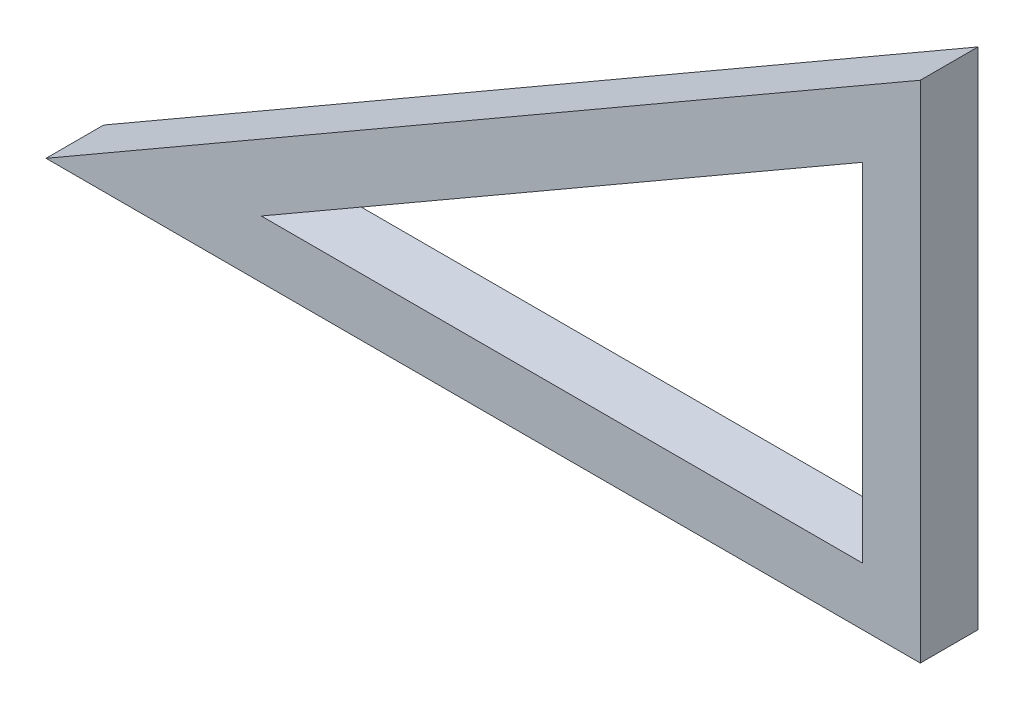
ISO-10303-21;
HEADER;
FILE_DESCRIPTION(('STEP AP214'),'2;1');
FILE_NAME('part.step','',(''),(''),'','','');
FILE_SCHEMA(('AUTOMOTIVE_DESIGN { 1 0 10303 214 1 1 1 1 }'));
ENDSEC;
DATA;
#1=APPLICATION_CONTEXT('core data for automotive mechanical design processes');
#2=APPLICATION_PROTOCOL_DEFINITION('international standard','automotive_design',2000,#1);
#3=PRODUCT_CONTEXT('',#1,'mechanical');
#4=PRODUCT('Part','Part','',(#3));
#5=PRODUCT_RELATED_PRODUCT_CATEGORY('part','',(#4));
#6=PRODUCT_DEFINITION_FORMATION('','',#4);
#7=PRODUCT_DEFINITION_CONTEXT('part definition',#1,'design');
#8=PRODUCT_DEFINITION('design','',#6,#7);
#9=PRODUCT_DEFINITION_SHAPE('','',#8);
#10=(LENGTH_UNIT() NAMED_UNIT(*) SI_UNIT(.MILLI.,.METRE.));
#11=(NAMED_UNIT(*) PLANE_ANGLE_UNIT() SI_UNIT($,.RADIAN.));
#12=(NAMED_UNIT(*) SI_UNIT($,.STERADIAN.) SOLID_ANGLE_UNIT());
#13=UNCERTAINTY_MEASURE_WITH_UNIT(LENGTH_MEASURE(1.E-05),#10,'distance_accuracy_value','');
#14=(GEOMETRIC_REPRESENTATION_CONTEXT(3) GLOBAL_UNCERTAINTY_ASSIGNED_CONTEXT((#13)) GLOBAL_UNIT_ASSIGNED_CONTEXT((#10,
#11,#12)) REPRESENTATION_CONTEXT('',''));
#15=CARTESIAN_POINT('',(0.,0.,0.));
#16=DIRECTION('',(0.,0.,1.));
#17=DIRECTION('',(1.,0.,0.));
#18=AXIS2_PLACEMENT_3D('',#15,#16,#17);
#19=CARTESIAN_POINT('',(0.,0.,20.));
#20=DIRECTION('',(0.,0.,-1.));
#21=DIRECTION('',(-1.,0.,0.));
#22=AXIS2_PLACEMENT_3D('',#19,#20,#21);
#23=PLANE('',#22);
#24=DIRECTION('',(-0.866025403784442,-0.499999999999995,0.));
#25=VECTOR('',#24,1.);
#26=CARTESIAN_POINT('',(303.108891324554,174.999999999998,20.));
#27=LINE('',#26,#25);
#28=CARTESIAN_POINT('',(303.108891324554,174.999999999998,20.));
#29=VERTEX_POINT('',#28);
#30=CARTESIAN_POINT('',(0.,0.,20.));
#31=VERTEX_POINT('',#30);
#32=EDGE_CURVE('E112',#29,#31,#27,.T.);
#33=ORIENTED_EDGE('',*,*,#32,.T.);
#34=DIRECTION('',(1.,0.,0.));
#35=VECTOR('',#34,1.);
#36=CARTESIAN_POINT('',(0.,0.,20.));
#37=LINE('',#36,#35);
#38=CARTESIAN_POINT('',(303.108891324555,0.,20.));
#39=VERTEX_POINT('',#38);
#40=EDGE_CURVE('E115',#31,#39,#37,.T.);
#41=ORIENTED_EDGE('',*,*,#40,.T.);
#42=DIRECTION('',(0.,1.,0.));
#43=VECTOR('',#42,1.);
#44=CARTESIAN_POINT('',(303.108891324555,0.,20.));
#45=LINE('',#44,#43);
#46=EDGE_CURVE('E118',#39,#29,#45,.T.);
#47=ORIENTED_EDGE('',*,*,#46,.T.);
#48=EDGE_LOOP('',(#33,#41,#47));
#49=FACE_BOUND('',#48,.T.);
#50=DIRECTION('',(0.,1.,0.));
#51=VECTOR('',#50,1.);
#52=CARTESIAN_POINT('',(283.108891324555,20.,20.));
#53=LINE('',#52,#51);
#54=CARTESIAN_POINT('',(283.108891324555,20.,20.));
#55=VERTEX_POINT('',#54);
#56=CARTESIAN_POINT('',(283.108891324555,140.358983848621,20.));
#57=VERTEX_POINT('',#56);
#58=EDGE_CURVE('E85',#55,#57,#53,.T.);
#59=ORIENTED_EDGE('',*,*,#58,.F.);
#60=DIRECTION('',(1.,0.,0.));
#61=VECTOR('',#60,1.);
#62=CARTESIAN_POINT('',(74.6410161513784,20.,20.));
#63=LINE('',#62,#61);
#64=CARTESIAN_POINT('',(74.6410161513784,20.,20.));
#65=VERTEX_POINT('',#64);
#66=EDGE_CURVE('E102',#65,#55,#63,.T.);
#67=ORIENTED_EDGE('',*,*,#66,.F.);
#68=DIRECTION('',(-0.866025403784442,-0.499999999999995,0.));
#69=VECTOR('',#68,1.);
#70=CARTESIAN_POINT('',(283.108891324555,140.358983848621,20.));
#71=LINE('',#70,#69);
#72=EDGE_CURVE('E93',#57,#65,#71,.T.);
#73=ORIENTED_EDGE('',*,*,#72,.F.);
#74=EDGE_LOOP('',(#59,#67,#73));
#75=FACE_BOUND('',#74,.T.);
#76=ADVANCED_FACE('F32',(#49,#75),#23,.F.);
#77=CARTESIAN_POINT('',(0.,0.,0.));
#78=DIRECTION('',(0.,0.,-1.));
#79=DIRECTION('',(-1.,0.,0.));
#80=AXIS2_PLACEMENT_3D('',#77,#78,#79);
#81=PLANE('',#80);
#82=DIRECTION('',(-0.866025403784442,-0.499999999999995,0.));
#83=VECTOR('',#82,1.);
#84=CARTESIAN_POINT('',(303.108891324554,174.999999999998,0.));
#85=LINE('',#84,#83);
#86=CARTESIAN_POINT('',(303.108891324554,174.999999999998,0.));
#87=VERTEX_POINT('',#86);
#88=CARTESIAN_POINT('',(0.,0.,0.));
#89=VERTEX_POINT('',#88);
#90=EDGE_CURVE('E100',#87,#89,#85,.T.);
#91=ORIENTED_EDGE('',*,*,#90,.F.);
#92=DIRECTION('',(0.,1.,0.));
#93=VECTOR('',#92,1.);
#94=CARTESIAN_POINT('',(303.108891324555,0.,0.));
#95=LINE('',#94,#93);
#96=CARTESIAN_POINT('',(303.108891324555,0.,0.));
#97=VERTEX_POINT('',#96);
#98=EDGE_CURVE('E116',#97,#87,#95,.T.);
#99=ORIENTED_EDGE('',*,*,#98,.F.);
#100=DIRECTION('',(1.,0.,0.));
#101=VECTOR('',#100,1.);
#102=CARTESIAN_POINT('',(0.,0.,0.));
#103=LINE('',#102,#101);
#104=EDGE_CURVE('E123',#89,#97,#103,.T.);
#105=ORIENTED_EDGE('',*,*,#104,.F.);
#106=EDGE_LOOP('',(#91,#99,#105));
#107=FACE_BOUND('',#106,.T.);
#108=DIRECTION('',(1.,0.,0.));
#109=VECTOR('',#108,1.);
#110=CARTESIAN_POINT('',(74.6410161513784,20.,0.));
#111=LINE('',#110,#109);
#112=CARTESIAN_POINT('',(74.6410161513784,20.,0.));
#113=VERTEX_POINT('',#112);
#114=CARTESIAN_POINT('',(283.108891324555,20.,0.));
#115=VERTEX_POINT('',#114);
#116=EDGE_CURVE('E94',#113,#115,#111,.T.);
#117=ORIENTED_EDGE('',*,*,#116,.T.);
#118=DIRECTION('',(0.,1.,0.));
#119=VECTOR('',#118,1.);
#120=CARTESIAN_POINT('',(283.108891324555,20.,0.));
#121=LINE('',#120,#119);
#122=CARTESIAN_POINT('',(283.108891324555,140.358983848621,0.));
#123=VERTEX_POINT('',#122);
#124=EDGE_CURVE('E55',#115,#123,#121,.T.);
#125=ORIENTED_EDGE('',*,*,#124,.T.);
#126=DIRECTION('',(-0.866025403784442,-0.499999999999995,0.));
#127=VECTOR('',#126,1.);
#128=CARTESIAN_POINT('',(283.108891324555,140.358983848621,0.));
#129=LINE('',#128,#127);
#130=EDGE_CURVE('E99',#123,#113,#129,.T.);
#131=ORIENTED_EDGE('',*,*,#130,.T.);
#132=EDGE_LOOP('',(#117,#125,#131));
#133=FACE_BOUND('',#132,.T.);
#134=ADVANCED_FACE('F137',(#107,#133),#81,.T.);
#135=CARTESIAN_POINT('',(303.108891324554,174.999999999998,20.));
#136=DIRECTION('',(0.499999999999995,-0.866025403784442,0.));
#137=DIRECTION('',(0.866025403784442,0.499999999999995,0.));
#138=AXIS2_PLACEMENT_3D('',#135,#136,#137);
#139=PLANE('',#138);
#140=ORIENTED_EDGE('',*,*,#90,.T.);
#141=DIRECTION('',(0.,0.,-1.));
#142=VECTOR('',#141,1.);
#143=CARTESIAN_POINT('',(0.,0.,20.));
#144=LINE('',#143,#142);
#145=EDGE_CURVE('E11',#31,#89,#144,.T.);
#146=ORIENTED_EDGE('',*,*,#145,.F.);
#147=ORIENTED_EDGE('',*,*,#32,.F.);
#148=DIRECTION('',(0.,0.,-1.));
#149=VECTOR('',#148,1.);
#150=CARTESIAN_POINT('',(303.108891324554,174.999999999998,20.));
#151=LINE('',#150,#149);
#152=EDGE_CURVE('E120',#29,#87,#151,.T.);
#153=ORIENTED_EDGE('',*,*,#152,.T.);
#154=EDGE_LOOP('',(#140,#146,#147,#153));
#155=FACE_BOUND('',#154,.T.);
#156=ADVANCED_FACE('F34',(#155),#139,.F.);
#157=CARTESIAN_POINT('',(0.,0.,20.));
#158=DIRECTION('',(0.,1.,0.));
#159=DIRECTION('',(0.,0.,1.));
#160=AXIS2_PLACEMENT_3D('',#157,#158,#159);
#161=PLANE('',#160);
#162=ORIENTED_EDGE('',*,*,#104,.T.);
#163=DIRECTION('',(0.,0.,-1.));
#164=VECTOR('',#163,1.);
#165=CARTESIAN_POINT('',(303.108891324555,0.,20.));
#166=LINE('',#165,#164);
#167=EDGE_CURVE('E40',#39,#97,#166,.T.);
#168=ORIENTED_EDGE('',*,*,#167,.F.);
#169=ORIENTED_EDGE('',*,*,#40,.F.);
#170=ORIENTED_EDGE('',*,*,#145,.T.);
#171=EDGE_LOOP('',(#162,#168,#169,#170));
#172=FACE_BOUND('',#171,.T.);
#173=ADVANCED_FACE('F143',(#172),#161,.F.);
#174=CARTESIAN_POINT('',(303.108891324555,0.,20.));
#175=DIRECTION('',(-1.,0.,0.));
#176=DIRECTION('',(0.,-1.,0.));
#177=AXIS2_PLACEMENT_3D('',#174,#175,#176);
#178=PLANE('',#177);
#179=ORIENTED_EDGE('',*,*,#98,.T.);
#180=ORIENTED_EDGE('',*,*,#152,.F.);
#181=ORIENTED_EDGE('',*,*,#46,.F.);
#182=ORIENTED_EDGE('',*,*,#167,.T.);
#183=EDGE_LOOP('',(#179,#180,#181,#182));
#184=FACE_BOUND('',#183,.T.);
#185=ADVANCED_FACE('F132',(#184),#178,.F.);
#186=CARTESIAN_POINT('',(283.108891324555,20.,20.));
#187=DIRECTION('',(-1.,0.,0.));
#188=DIRECTION('',(0.,0.,1.));
#189=AXIS2_PLACEMENT_3D('',#186,#187,#188);
#190=PLANE('',#189);
#191=ORIENTED_EDGE('',*,*,#124,.F.);
#192=DIRECTION('',(0.,0.,-1.));
#193=VECTOR('',#192,1.);
#194=CARTESIAN_POINT('',(283.108891324555,20.,20.));
#195=LINE('',#194,#193);
#196=EDGE_CURVE('E89',#55,#115,#195,.T.);
#197=ORIENTED_EDGE('',*,*,#196,.F.);
#198=ORIENTED_EDGE('',*,*,#58,.T.);
#199=DIRECTION('',(0.,0.,-1.));
#200=VECTOR('',#199,1.);
#201=CARTESIAN_POINT('',(283.108891324555,140.358983848621,20.));
#202=LINE('',#201,#200);
#203=EDGE_CURVE('E88',#57,#123,#202,.T.);
#204=ORIENTED_EDGE('',*,*,#203,.T.);
#205=EDGE_LOOP('',(#191,#197,#198,#204));
#206=FACE_BOUND('',#205,.T.);
#207=ADVANCED_FACE('F87',(#206),#190,.T.);
#208=CARTESIAN_POINT('',(283.108891324555,140.358983848621,20.));
#209=DIRECTION('',(0.499999999999995,-0.866025403784442,0.));
#210=DIRECTION('',(0.866025403784442,0.499999999999995,0.));
#211=AXIS2_PLACEMENT_3D('',#208,#209,#210);
#212=PLANE('',#211);
#213=ORIENTED_EDGE('',*,*,#130,.F.);
#214=ORIENTED_EDGE('',*,*,#203,.F.);
#215=ORIENTED_EDGE('',*,*,#72,.T.);
#216=DIRECTION('',(0.,0.,-1.));
#217=VECTOR('',#216,1.);
#218=CARTESIAN_POINT('',(74.6410161513784,20.,20.));
#219=LINE('',#218,#217);
#220=EDGE_CURVE('E47',#65,#113,#219,.T.);
#221=ORIENTED_EDGE('',*,*,#220,.T.);
#222=EDGE_LOOP('',(#213,#214,#215,#221));
#223=FACE_BOUND('',#222,.T.);
#224=ADVANCED_FACE('F97',(#223),#212,.T.);
#225=CARTESIAN_POINT('',(74.6410161513784,20.,20.));
#226=DIRECTION('',(0.,1.,0.));
#227=DIRECTION('',(-1.,0.,0.));
#228=AXIS2_PLACEMENT_3D('',#225,#226,#227);
#229=PLANE('',#228);
#230=ORIENTED_EDGE('',*,*,#116,.F.);
#231=ORIENTED_EDGE('',*,*,#220,.F.);
#232=ORIENTED_EDGE('',*,*,#66,.T.);
#233=ORIENTED_EDGE('',*,*,#196,.T.);
#234=EDGE_LOOP('',(#230,#231,#232,#233));
#235=FACE_BOUND('',#234,.T.);
#236=ADVANCED_FACE('F161',(#235),#229,.T.);
#237=CLOSED_SHELL('',(#76,#134,#156,#173,#185,#207,#224,#236));
#238=MANIFOLD_SOLID_BREP('B2',#237);
#239=ADVANCED_BREP_SHAPE_REPRESENTATION('',(#18,#238),#14);
#240=SHAPE_DEFINITION_REPRESENTATION(#9,#239);
ENDSEC;
END-ISO-10303-21;
